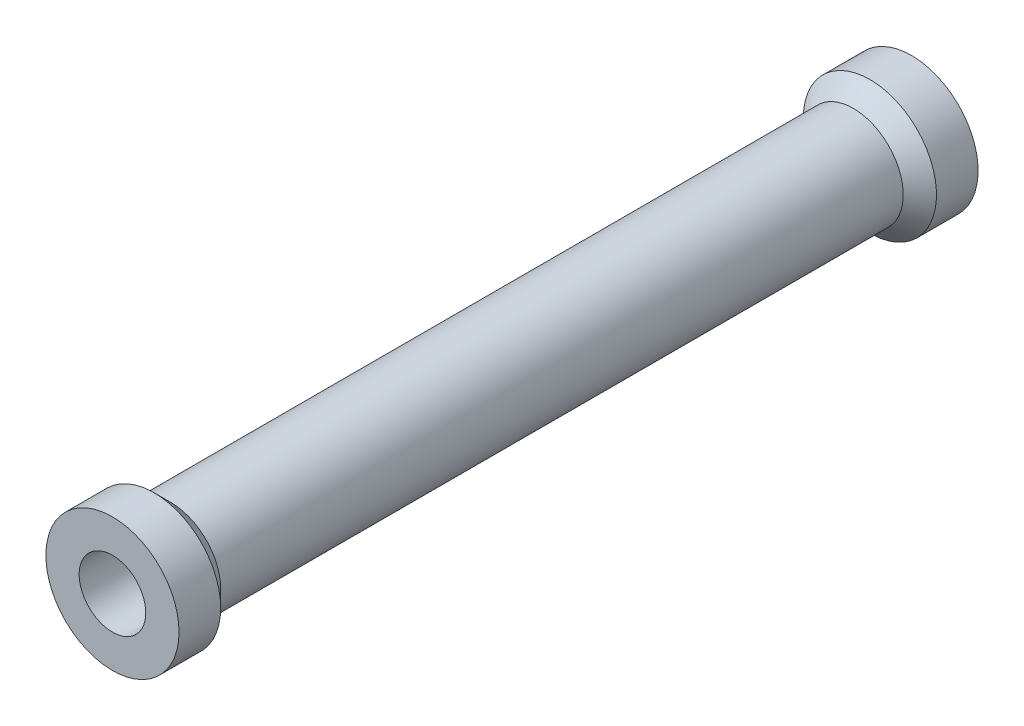
ISO-10303-21;
HEADER;
FILE_DESCRIPTION(('STEP AP214'),'2;1');
FILE_NAME('part.step','',(''),(''),'','','');
FILE_SCHEMA(('AUTOMOTIVE_DESIGN { 1 0 10303 214 1 1 1 1 }'));
ENDSEC;
DATA;
#1=APPLICATION_CONTEXT('core data for automotive mechanical design processes');
#2=APPLICATION_PROTOCOL_DEFINITION('international standard','automotive_design',2000,#1);
#3=PRODUCT_CONTEXT('',#1,'mechanical');
#4=PRODUCT('Part','Part','',(#3));
#5=PRODUCT_RELATED_PRODUCT_CATEGORY('part','',(#4));
#6=PRODUCT_DEFINITION_FORMATION('','',#4);
#7=PRODUCT_DEFINITION_CONTEXT('part definition',#1,'design');
#8=PRODUCT_DEFINITION('design','',#6,#7);
#9=PRODUCT_DEFINITION_SHAPE('','',#8);
#10=(LENGTH_UNIT() NAMED_UNIT(*) SI_UNIT(.MILLI.,.METRE.));
#11=(NAMED_UNIT(*) PLANE_ANGLE_UNIT() SI_UNIT($,.RADIAN.));
#12=(NAMED_UNIT(*) SI_UNIT($,.STERADIAN.) SOLID_ANGLE_UNIT());
#13=UNCERTAINTY_MEASURE_WITH_UNIT(LENGTH_MEASURE(1.E-05),#10,'distance_accuracy_value','');
#14=(GEOMETRIC_REPRESENTATION_CONTEXT(3) GLOBAL_UNCERTAINTY_ASSIGNED_CONTEXT((#13)) GLOBAL_UNIT_ASSIGNED_CONTEXT((#10,
#11,#12)) REPRESENTATION_CONTEXT('',''));
#15=CARTESIAN_POINT('',(0.,0.,0.));
#16=DIRECTION('',(0.,0.,1.));
#17=DIRECTION('',(1.,0.,0.));
#18=AXIS2_PLACEMENT_3D('',#15,#16,#17);
#19=CARTESIAN_POINT('',(0.,0.,31.75));
#20=DIRECTION('',(0.,0.,-1.));
#21=DIRECTION('',(-1.,0.,0.));
#22=AXIS2_PLACEMENT_3D('',#19,#20,#21);
#23=CYLINDRICAL_SURFACE('',#22,4.7625);
#24=CARTESIAN_POINT('',(0.,0.,-32.5425));
#25=DIRECTION('',(0.,0.,-1.));
#26=DIRECTION('',(-1.,0.,0.));
#27=AXIS2_PLACEMENT_3D('',#24,#25,#26);
#28=CIRCLE('',#27,4.7625);
#29=CARTESIAN_POINT('',(-4.7625,0.,-32.5425));
#30=VERTEX_POINT('',#29);
#31=EDGE_CURVE('E10',#30,#30,#28,.F.);
#32=CARTESIAN_POINT('',(0.,0.,32.5425));
#33=DIRECTION('',(0.,0.,1.));
#34=DIRECTION('',(1.,0.,0.));
#35=AXIS2_PLACEMENT_3D('',#32,#33,#34);
#36=CIRCLE('',#35,4.7625);
#37=CARTESIAN_POINT('',(-4.7625,0.,32.5425));
#38=VERTEX_POINT('',#37);
#39=EDGE_CURVE('E46',#38,#38,#36,.F.);
#40=CARTESIAN_POINT('',(-4.7625,0.,-32.5425));
#41=CARTESIAN_POINT('',(-4.7625,0.,-31.86453125));
#42=CARTESIAN_POINT('',(-4.7625,0.,-31.1865625));
#43=CARTESIAN_POINT('',(-4.7625,0.,-29.830625));
#44=CARTESIAN_POINT('',(-4.7625,0.,-29.15265625));
#45=CARTESIAN_POINT('',(-4.7625,0.,-27.79671875));
#46=CARTESIAN_POINT('',(-4.7625,0.,-27.11875));
#47=CARTESIAN_POINT('',(-4.7625,0.,-25.7628125));
#48=CARTESIAN_POINT('',(-4.7625,0.,-25.08484375));
#49=CARTESIAN_POINT('',(-4.7625,0.,-23.72890625));
#50=CARTESIAN_POINT('',(-4.7625,0.,-23.0509375));
#51=CARTESIAN_POINT('',(-4.7625,0.,-21.695));
#52=CARTESIAN_POINT('',(-4.7625,0.,-21.01703125));
#53=CARTESIAN_POINT('',(-4.7625,0.,-19.66109375));
#54=CARTESIAN_POINT('',(-4.7625,0.,-18.983125));
#55=CARTESIAN_POINT('',(-4.7625,0.,-17.6271875));
#56=CARTESIAN_POINT('',(-4.7625,0.,-16.94921875));
#57=CARTESIAN_POINT('',(-4.7625,0.,-15.59328125));
#58=CARTESIAN_POINT('',(-4.7625,0.,-14.9153125));
#59=CARTESIAN_POINT('',(-4.7625,0.,-13.559375));
#60=CARTESIAN_POINT('',(-4.7625,0.,-12.88140625));
#61=CARTESIAN_POINT('',(-4.7625,0.,-11.52546875));
#62=CARTESIAN_POINT('',(-4.7625,0.,-10.8475));
#63=CARTESIAN_POINT('',(-4.7625,0.,-9.49156250000001));
#64=CARTESIAN_POINT('',(-4.7625,0.,-8.81359375000001));
#65=CARTESIAN_POINT('',(-4.7625,0.,-7.45765625000001));
#66=CARTESIAN_POINT('',(-4.7625,0.,-6.77968750000001));
#67=CARTESIAN_POINT('',(-4.7625,0.,-5.42375000000001));
#68=CARTESIAN_POINT('',(-4.7625,0.,-4.74578125000001));
#69=CARTESIAN_POINT('',(-4.7625,0.,-3.38984375000001));
#70=CARTESIAN_POINT('',(-4.7625,0.,-2.71187500000001));
#71=CARTESIAN_POINT('',(-4.7625,0.,-1.35593750000001));
#72=CARTESIAN_POINT('',(-4.7625,0.,-0.677968750000008));
#73=CARTESIAN_POINT('',(-4.7625,0.,0.677968749999994));
#74=CARTESIAN_POINT('',(-4.7625,0.,1.35593749999999));
#75=CARTESIAN_POINT('',(-4.7625,0.,2.711875));
#76=CARTESIAN_POINT('',(-4.7625,0.,3.38984375));
#77=CARTESIAN_POINT('',(-4.7625,0.,4.74578125));
#78=CARTESIAN_POINT('',(-4.7625,0.,5.42375));
#79=CARTESIAN_POINT('',(-4.7625,0.,6.7796875));
#80=CARTESIAN_POINT('',(-4.7625,0.,7.45765625));
#81=CARTESIAN_POINT('',(-4.7625,0.,8.81359375));
#82=CARTESIAN_POINT('',(-4.7625,0.,9.4915625));
#83=CARTESIAN_POINT('',(-4.7625,0.,10.8475));
#84=CARTESIAN_POINT('',(-4.7625,0.,11.52546875));
#85=CARTESIAN_POINT('',(-4.7625,0.,12.88140625));
#86=CARTESIAN_POINT('',(-4.7625,0.,13.559375));
#87=CARTESIAN_POINT('',(-4.7625,0.,14.9153125));
#88=CARTESIAN_POINT('',(-4.7625,0.,15.59328125));
#89=CARTESIAN_POINT('',(-4.7625,0.,16.94921875));
#90=CARTESIAN_POINT('',(-4.7625,0.,17.6271875));
#91=CARTESIAN_POINT('',(-4.7625,0.,18.983125));
#92=CARTESIAN_POINT('',(-4.7625,0.,19.66109375));
#93=CARTESIAN_POINT('',(-4.7625,0.,21.01703125));
#94=CARTESIAN_POINT('',(-4.7625,0.,21.695));
#95=CARTESIAN_POINT('',(-4.7625,0.,23.0509375));
#96=CARTESIAN_POINT('',(-4.7625,0.,23.72890625));
#97=CARTESIAN_POINT('',(-4.7625,0.,25.08484375));
#98=CARTESIAN_POINT('',(-4.7625,0.,25.7628125));
#99=CARTESIAN_POINT('',(-4.7625,0.,27.11875));
#100=CARTESIAN_POINT('',(-4.7625,0.,27.79671875));
#101=CARTESIAN_POINT('',(-4.7625,0.,29.15265625));
#102=CARTESIAN_POINT('',(-4.7625,0.,29.830625));
#103=CARTESIAN_POINT('',(-4.7625,0.,31.1865625));
#104=CARTESIAN_POINT('',(-4.7625,0.,31.86453125));
#105=CARTESIAN_POINT('',(-4.7625,0.,32.5425));
#106=B_SPLINE_CURVE_WITH_KNOTS('',3,(#40,#41,#42,#43,#44,#45,#46,#47,#48,#49,#50,#51,#52,#53,
#54,#55,#56,#57,#58,#59,#60,#61,#62,#63,#64,#65,#66,#67,#68,#69,#70,#71,#72,#73,#74,#75,#76,#77,
#78,#79,#80,#81,#82,#83,#84,#85,#86,#87,#88,#89,#90,#91,#92,#93,#94,#95,#96,#97,#98,#99,#100,
#101,#102,#103,#104,#105),.UNSPECIFIED.,.F.,.F.,(4,2,2,2,2,2,2,2,2,2,2,2,2,2,2,2,2,2,2,2,2,2,2,
2,2,2,2,2,2,2,2,2,4),(0.,2.03390625,4.0678125,6.10171875000001,8.13562500000001,10.16953125,
12.2034375,14.23734375,16.27125,18.30515625,20.3390625,22.37296875,24.406875,26.44078125,
28.4746875,30.50859375,32.5425,34.57640625,36.6103125,38.64421875,40.678125,42.71203125,
44.7459375,46.77984375,48.81375,50.84765625,52.8815625,54.91546875,56.949375,58.98328125,
61.0171875,63.05109375,65.0850000000001),.UNSPECIFIED.);
#107=EDGE_CURVE('BSEAM34',#30,#38,#106,.T.);
#108=ORIENTED_EDGE('',*,*,#31,.T.);
#109=ORIENTED_EDGE('',*,*,#39,.T.);
#110=ORIENTED_EDGE('',*,*,#107,.T.);
#111=ORIENTED_EDGE('',*,*,#107,.F.);
#112=EDGE_LOOP('',(#108,#110,#109,#111));
#113=FACE_BOUND('',#112,.T.);
#114=ADVANCED_FACE('F34',(#113),#23,.T.);
#115=CARTESIAN_POINT('',(0.,0.,38.1));
#116=DIRECTION('',(0.,0.,-1.));
#117=DIRECTION('',(-1.,0.,0.));
#118=AXIS2_PLACEMENT_3D('',#115,#116,#117);
#119=CYLINDRICAL_SURFACE('',#118,6.35);
#120=CARTESIAN_POINT('',(0.,0.,34.13));
#121=DIRECTION('',(0.,0.,1.));
#122=DIRECTION('',(1.,0.,0.));
#123=AXIS2_PLACEMENT_3D('',#120,#121,#122);
#124=CIRCLE('',#123,6.35);
#125=CARTESIAN_POINT('',(6.35,0.,34.13));
#126=VERTEX_POINT('',#125);
#127=EDGE_CURVE('E50',#126,#126,#124,.T.);
#128=ORIENTED_EDGE('',*,*,#127,.T.);
#129=EDGE_LOOP('',(#128));
#130=FACE_BOUND('',#129,.T.);
#131=CARTESIAN_POINT('',(0.,0.,38.1));
#132=DIRECTION('',(0.,0.,1.));
#133=DIRECTION('',(1.,0.,0.));
#134=AXIS2_PLACEMENT_3D('',#131,#132,#133);
#135=CIRCLE('',#134,6.35);
#136=CARTESIAN_POINT('',(6.35,0.,38.1));
#137=VERTEX_POINT('',#136);
#138=EDGE_CURVE('E55',#137,#137,#135,.T.);
#139=ORIENTED_EDGE('',*,*,#138,.F.);
#140=EDGE_LOOP('',(#139));
#141=FACE_BOUND('',#140,.T.);
#142=ADVANCED_FACE('F99',(#130,#141),#119,.T.);
#143=CARTESIAN_POINT('',(0.,0.,38.1));
#144=DIRECTION('',(0.,0.,1.));
#145=DIRECTION('',(1.,0.,0.));
#146=AXIS2_PLACEMENT_3D('',#143,#144,#145);
#147=PLANE('',#146);
#148=CARTESIAN_POINT('',(0.,0.,38.1));
#149=DIRECTION('',(0.,0.,1.));
#150=DIRECTION('',(1.,0.,0.));
#151=AXIS2_PLACEMENT_3D('',#148,#149,#150);
#152=CIRCLE('',#151,3.175);
#153=CARTESIAN_POINT('',(3.175,0.,38.1));
#154=VERTEX_POINT('',#153);
#155=EDGE_CURVE('E59',#154,#154,#152,.T.);
#156=ORIENTED_EDGE('',*,*,#155,.F.);
#157=EDGE_LOOP('',(#156));
#158=FACE_BOUND('',#157,.T.);
#159=ORIENTED_EDGE('',*,*,#138,.T.);
#160=EDGE_LOOP('',(#159));
#161=FACE_BOUND('',#160,.T.);
#162=ADVANCED_FACE('F104',(#158,#161),#147,.T.);
#163=CARTESIAN_POINT('',(0.,0.,34.13));
#164=DIRECTION('',(0.,0.,1.));
#165=DIRECTION('',(1.,0.,0.));
#166=AXIS2_PLACEMENT_3D('',#163,#164,#165);
#167=CONICAL_SURFACE('',#166,6.35,0.785398163397443);
#168=ORIENTED_EDGE('',*,*,#39,.F.);
#169=EDGE_LOOP('',(#168));
#170=FACE_BOUND('',#169,.T.);
#171=ORIENTED_EDGE('',*,*,#127,.F.);
#172=EDGE_LOOP('',(#171));
#173=FACE_BOUND('',#172,.T.);
#174=ADVANCED_FACE('F110',(#170,#173),#167,.T.);
#175=CARTESIAN_POINT('',(0.,0.,25.4));
#176=DIRECTION('',(0.,0.,1.));
#177=DIRECTION('',(1.,0.,0.));
#178=AXIS2_PLACEMENT_3D('',#175,#176,#177);
#179=CYLINDRICAL_SURFACE('',#178,3.175);
#180=CARTESIAN_POINT('',(0.,0.,25.4));
#181=DIRECTION('',(0.,0.,1.));
#182=DIRECTION('',(1.,0.,0.));
#183=AXIS2_PLACEMENT_3D('',#180,#181,#182);
#184=CIRCLE('',#183,3.175);
#185=CARTESIAN_POINT('',(3.175,0.,25.4));
#186=VERTEX_POINT('',#185);
#187=EDGE_CURVE('E58',#186,#186,#184,.T.);
#188=ORIENTED_EDGE('',*,*,#187,.F.);
#189=EDGE_LOOP('',(#188));
#190=FACE_BOUND('',#189,.T.);
#191=ORIENTED_EDGE('',*,*,#155,.T.);
#192=EDGE_LOOP('',(#191));
#193=FACE_BOUND('',#192,.T.);
#194=ADVANCED_FACE('F95',(#190,#193),#179,.F.);
#195=CARTESIAN_POINT('',(0.,0.,25.4));
#196=DIRECTION('',(0.,0.,1.));
#197=DIRECTION('',(1.,0.,0.));
#198=AXIS2_PLACEMENT_3D('',#195,#196,#197);
#199=PLANE('',#198);
#200=ORIENTED_EDGE('',*,*,#187,.T.);
#201=EDGE_LOOP('',(#200));
#202=FACE_BOUND('',#201,.T.);
#203=ADVANCED_FACE('F90',(#202),#199,.T.);
#204=CARTESIAN_POINT('',(0.,0.,-38.1));
#205=DIRECTION('',(0.,0.,1.));
#206=DIRECTION('',(1.,0.,0.));
#207=AXIS2_PLACEMENT_3D('',#204,#205,#206);
#208=CYLINDRICAL_SURFACE('',#207,6.35);
#209=CARTESIAN_POINT('',(0.,0.,-34.13));
#210=DIRECTION('',(0.,0.,-1.));
#211=DIRECTION('',(-1.,0.,0.));
#212=AXIS2_PLACEMENT_3D('',#209,#210,#211);
#213=CIRCLE('',#212,6.35);
#214=CARTESIAN_POINT('',(-6.35,0.,-34.13));
#215=VERTEX_POINT('',#214);
#216=EDGE_CURVE('E42',#215,#215,#213,.T.);
#217=ORIENTED_EDGE('',*,*,#216,.T.);
#218=EDGE_LOOP('',(#217));
#219=FACE_BOUND('',#218,.T.);
#220=CARTESIAN_POINT('',(0.,0.,-38.1));
#221=DIRECTION('',(0.,0.,-1.));
#222=DIRECTION('',(-1.,0.,0.));
#223=AXIS2_PLACEMENT_3D('',#220,#221,#222);
#224=CIRCLE('',#223,6.35);
#225=CARTESIAN_POINT('',(-6.35,0.,-38.1));
#226=VERTEX_POINT('',#225);
#227=EDGE_CURVE('E62',#226,#226,#224,.T.);
#228=ORIENTED_EDGE('',*,*,#227,.F.);
#229=EDGE_LOOP('',(#228));
#230=FACE_BOUND('',#229,.T.);
#231=ADVANCED_FACE('F85',(#219,#230),#208,.T.);
#232=CARTESIAN_POINT('',(0.,0.,-38.1));
#233=DIRECTION('',(0.,0.,-1.));
#234=DIRECTION('',(-1.,0.,0.));
#235=AXIS2_PLACEMENT_3D('',#232,#233,#234);
#236=PLANE('',#235);
#237=CARTESIAN_POINT('',(0.,0.,-38.1));
#238=DIRECTION('',(0.,0.,-1.));
#239=DIRECTION('',(-1.,0.,0.));
#240=AXIS2_PLACEMENT_3D('',#237,#238,#239);
#241=CIRCLE('',#240,3.175);
#242=CARTESIAN_POINT('',(-3.175,0.,-38.1));
#243=VERTEX_POINT('',#242);
#244=EDGE_CURVE('E68',#243,#243,#241,.T.);
#245=ORIENTED_EDGE('',*,*,#244,.F.);
#246=EDGE_LOOP('',(#245));
#247=FACE_BOUND('',#246,.T.);
#248=ORIENTED_EDGE('',*,*,#227,.T.);
#249=EDGE_LOOP('',(#248));
#250=FACE_BOUND('',#249,.T.);
#251=ADVANCED_FACE('F82',(#247,#250),#236,.T.);
#252=CARTESIAN_POINT('',(0.,0.,-34.13));
#253=DIRECTION('',(0.,0.,-1.));
#254=DIRECTION('',(-1.,0.,0.));
#255=AXIS2_PLACEMENT_3D('',#252,#253,#254);
#256=CONICAL_SURFACE('',#255,6.35,0.785398163397443);
#257=CARTESIAN_POINT('',(-4.7625,0.,-32.5425));
#258=CARTESIAN_POINT('',(-4.77903645833333,0.,-32.5590364583334));
#259=CARTESIAN_POINT('',(-4.79557291666666,0.,-32.5755729166667));
#260=CARTESIAN_POINT('',(-4.82864583333333,0.,-32.6086458333334));
#261=CARTESIAN_POINT('',(-4.84518229166666,0.,-32.6251822916667));
#262=CARTESIAN_POINT('',(-4.87825520833333,0.,-32.6582552083334));
#263=CARTESIAN_POINT('',(-4.89479166666666,0.,-32.6747916666667));
#264=CARTESIAN_POINT('',(-4.92786458333333,0.,-32.7078645833334));
#265=CARTESIAN_POINT('',(-4.94440104166666,0.,-32.7244010416667));
#266=CARTESIAN_POINT('',(-4.97747395833333,0.,-32.7574739583334));
#267=CARTESIAN_POINT('',(-4.99401041666666,0.,-32.7740104166667));
#268=CARTESIAN_POINT('',(-5.02708333333333,0.,-32.8070833333334));
#269=CARTESIAN_POINT('',(-5.04361979166666,0.,-32.8236197916667));
#270=CARTESIAN_POINT('',(-5.07669270833333,0.,-32.8566927083334));
#271=CARTESIAN_POINT('',(-5.09322916666666,0.,-32.8732291666667));
#272=CARTESIAN_POINT('',(-5.12630208333333,0.,-32.9063020833334));
#273=CARTESIAN_POINT('',(-5.14283854166666,0.,-32.9228385416667));
#274=CARTESIAN_POINT('',(-5.17591145833333,0.,-32.9559114583334));
#275=CARTESIAN_POINT('',(-5.19244791666666,0.,-32.9724479166667));
#276=CARTESIAN_POINT('',(-5.22552083333333,0.,-33.0055208333334));
#277=CARTESIAN_POINT('',(-5.24205729166666,0.,-33.0220572916667));
#278=CARTESIAN_POINT('',(-5.27513020833333,0.,-33.0551302083334));
#279=CARTESIAN_POINT('',(-5.29166666666666,0.,-33.0716666666667));
#280=CARTESIAN_POINT('',(-5.32473958333333,0.,-33.1047395833334));
#281=CARTESIAN_POINT('',(-5.34127604166666,0.,-33.1212760416667));
#282=CARTESIAN_POINT('',(-5.37434895833333,0.,-33.1543489583334));
#283=CARTESIAN_POINT('',(-5.39088541666666,0.,-33.1708854166667));
#284=CARTESIAN_POINT('',(-5.42395833333333,0.,-33.2039583333334));
#285=CARTESIAN_POINT('',(-5.44049479166666,0.,-33.2204947916667));
#286=CARTESIAN_POINT('',(-5.47356770833333,0.,-33.2535677083334));
#287=CARTESIAN_POINT('',(-5.49010416666666,0.,-33.2701041666667));
#288=CARTESIAN_POINT('',(-5.52317708333333,0.,-33.3031770833334));
#289=CARTESIAN_POINT('',(-5.53971354166666,0.,-33.3197135416667));
#290=CARTESIAN_POINT('',(-5.57278645833333,0.,-33.3527864583334));
#291=CARTESIAN_POINT('',(-5.58932291666666,0.,-33.3693229166667));
#292=CARTESIAN_POINT('',(-5.62239583333333,0.,-33.4023958333334));
#293=CARTESIAN_POINT('',(-5.63893229166666,0.,-33.4189322916667));
#294=CARTESIAN_POINT('',(-5.67200520833333,0.,-33.4520052083334));
#295=CARTESIAN_POINT('',(-5.68854166666666,0.,-33.4685416666667));
#296=CARTESIAN_POINT('',(-5.72161458333333,0.,-33.5016145833334));
#297=CARTESIAN_POINT('',(-5.73815104166666,0.,-33.5181510416667));
#298=CARTESIAN_POINT('',(-5.77122395833333,0.,-33.5512239583334));
#299=CARTESIAN_POINT('',(-5.78776041666666,0.,-33.5677604166667));
#300=CARTESIAN_POINT('',(-5.82083333333333,0.,-33.6008333333334));
#301=CARTESIAN_POINT('',(-5.83736979166666,0.,-33.6173697916667));
#302=CARTESIAN_POINT('',(-5.87044270833333,0.,-33.6504427083334));
#303=CARTESIAN_POINT('',(-5.88697916666666,0.,-33.6669791666667));
#304=CARTESIAN_POINT('',(-5.92005208333333,0.,-33.7000520833334));
#305=CARTESIAN_POINT('',(-5.93658854166666,0.,-33.7165885416667));
#306=CARTESIAN_POINT('',(-5.96966145833333,0.,-33.7496614583334));
#307=CARTESIAN_POINT('',(-5.98619791666666,0.,-33.7661979166667));
#308=CARTESIAN_POINT('',(-6.01927083333333,0.,-33.7992708333334));
#309=CARTESIAN_POINT('',(-6.03580729166666,0.,-33.8158072916667));
#310=CARTESIAN_POINT('',(-6.06888020833333,0.,-33.8488802083334));
#311=CARTESIAN_POINT('',(-6.08541666666666,0.,-33.8654166666667));
#312=CARTESIAN_POINT('',(-6.11848958333333,0.,-33.8984895833334));
#313=CARTESIAN_POINT('',(-6.13502604166666,0.,-33.9150260416667));
#314=CARTESIAN_POINT('',(-6.16809895833333,0.,-33.9480989583334));
#315=CARTESIAN_POINT('',(-6.18463541666666,0.,-33.9646354166667));
#316=CARTESIAN_POINT('',(-6.21770833333333,0.,-33.9977083333334));
#317=CARTESIAN_POINT('',(-6.23424479166666,0.,-34.0142447916667));
#318=CARTESIAN_POINT('',(-6.26731770833333,0.,-34.0473177083334));
#319=CARTESIAN_POINT('',(-6.28385416666666,0.,-34.0638541666667));
#320=CARTESIAN_POINT('',(-6.31692708333333,0.,-34.0969270833334));
#321=CARTESIAN_POINT('',(-6.33346354166666,0.,-34.1134635416667));
#322=CARTESIAN_POINT('',(-6.35,0.,-34.13));
#323=B_SPLINE_CURVE_WITH_KNOTS('',3,(#257,#258,#259,#260,#261,#262,#263,#264,#265,#266,#267,
#268,#269,#270,#271,#272,#273,#274,#275,#276,#277,#278,#279,#280,#281,#282,#283,#284,#285,#286,
#287,#288,#289,#290,#291,#292,#293,#294,#295,#296,#297,#298,#299,#300,#301,#302,#303,#304,#305,
#306,#307,#308,#309,#310,#311,#312,#313,#314,#315,#316,#317,#318,#319,#320,#321,#322),
.UNSPECIFIED.,.F.,.F.,(4,2,2,2,2,2,2,2,2,2,2,2,2,2,2,2,2,2,2,2,2,2,2,2,2,2,2,2,2,2,2,2,4),(0.,
0.0701582509458499,0.140316501891704,0.210474752837558,0.280633003783413,0.350791254729263,
0.420949505675117,0.491107756620972,0.561266007566826,0.631424258512675,0.70158250945853,
0.771740760404384,0.841899011350239,0.912057262296089,0.982215513241943,1.0523737641878,
1.12253201513365,1.1926902660795,1.26284851702536,1.33300676797121,1.40316501891706,
1.47332326986291,1.54348152080877,1.61363977175462,1.68379802270048,1.75395627364633,
1.82411452459218,1.89427277553804,1.96443102648389,2.03458927742974,2.10474752837559,
2.17490577932145,2.2450640302673),.UNSPECIFIED.);
#324=EDGE_CURVE('BSEAM37',#30,#215,#323,.T.);
#325=ORIENTED_EDGE('',*,*,#31,.F.);
#326=ORIENTED_EDGE('',*,*,#216,.F.);
#327=ORIENTED_EDGE('',*,*,#324,.T.);
#328=ORIENTED_EDGE('',*,*,#324,.F.);
#329=EDGE_LOOP('',(#325,#327,#326,#328));
#330=FACE_BOUND('',#329,.T.);
#331=ADVANCED_FACE('F37',(#330),#256,.T.);
#332=CARTESIAN_POINT('',(0.,0.,-25.4));
#333=DIRECTION('',(0.,0.,-1.));
#334=DIRECTION('',(-1.,0.,0.));
#335=AXIS2_PLACEMENT_3D('',#332,#333,#334);
#336=CYLINDRICAL_SURFACE('',#335,3.175);
#337=CARTESIAN_POINT('',(0.,0.,-25.4));
#338=DIRECTION('',(0.,0.,-1.));
#339=DIRECTION('',(-1.,0.,0.));
#340=AXIS2_PLACEMENT_3D('',#337,#338,#339);
#341=CIRCLE('',#340,3.175);
#342=CARTESIAN_POINT('',(-3.175,0.,-25.4));
#343=VERTEX_POINT('',#342);
#344=EDGE_CURVE('E67',#343,#343,#341,.T.);
#345=ORIENTED_EDGE('',*,*,#344,.F.);
#346=EDGE_LOOP('',(#345));
#347=FACE_BOUND('',#346,.T.);
#348=ORIENTED_EDGE('',*,*,#244,.T.);
#349=EDGE_LOOP('',(#348));
#350=FACE_BOUND('',#349,.T.);
#351=ADVANCED_FACE('F76',(#347,#350),#336,.F.);
#352=CARTESIAN_POINT('',(0.,0.,-25.4));
#353=DIRECTION('',(0.,0.,-1.));
#354=DIRECTION('',(-1.,0.,0.));
#355=AXIS2_PLACEMENT_3D('',#352,#353,#354);
#356=PLANE('',#355);
#357=ORIENTED_EDGE('',*,*,#344,.T.);
#358=EDGE_LOOP('',(#357));
#359=FACE_BOUND('',#358,.T.);
#360=ADVANCED_FACE('F74',(#359),#356,.T.);
#361=CLOSED_SHELL('',(#114,#142,#162,#174,#194,#203,#231,#251,#331,#351,#360));
#362=MANIFOLD_SOLID_BREP('B2',#361);
#363=ADVANCED_BREP_SHAPE_REPRESENTATION('',(#18,#362),#14);
#364=SHAPE_DEFINITION_REPRESENTATION(#9,#363);
ENDSEC;
END-ISO-10303-21;
